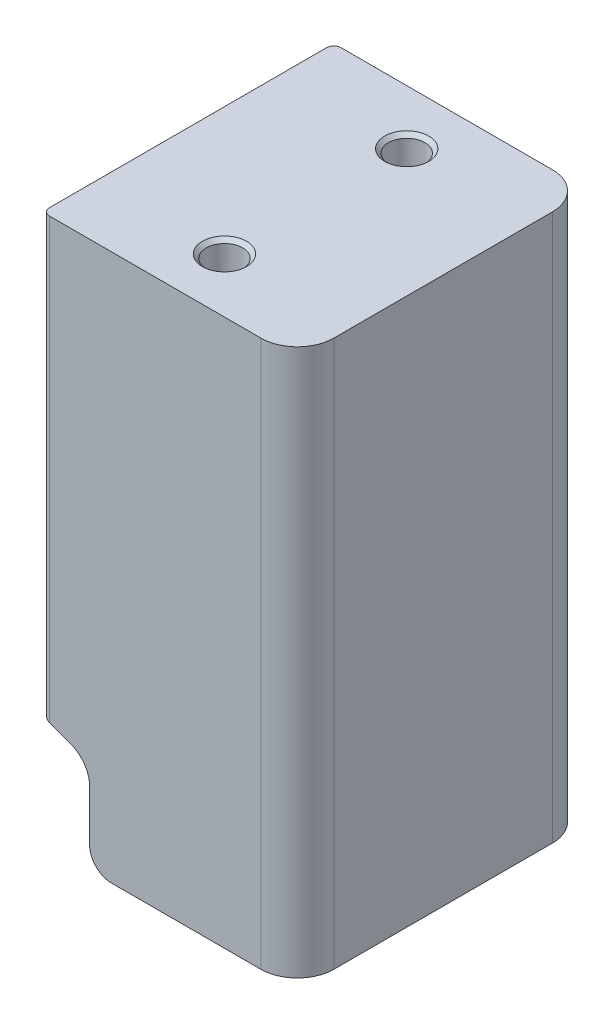
ISO-10303-21;
HEADER;
FILE_DESCRIPTION(('STEP AP214'),'2;1');
FILE_NAME('part.step','',(''),(''),'','','');
FILE_SCHEMA(('AUTOMOTIVE_DESIGN { 1 0 10303 214 1 1 1 1 }'));
ENDSEC;
DATA;
#1=APPLICATION_CONTEXT('core data for automotive mechanical design processes');
#2=APPLICATION_PROTOCOL_DEFINITION('international standard','automotive_design',2000,#1);
#3=PRODUCT_CONTEXT('',#1,'mechanical');
#4=PRODUCT('Part','Part','',(#3));
#5=PRODUCT_RELATED_PRODUCT_CATEGORY('part','',(#4));
#6=PRODUCT_DEFINITION_FORMATION('','',#4);
#7=PRODUCT_DEFINITION_CONTEXT('part definition',#1,'design');
#8=PRODUCT_DEFINITION('design','',#6,#7);
#9=PRODUCT_DEFINITION_SHAPE('','',#8);
#10=(LENGTH_UNIT() NAMED_UNIT(*) SI_UNIT(.MILLI.,.METRE.));
#11=(NAMED_UNIT(*) PLANE_ANGLE_UNIT() SI_UNIT($,.RADIAN.));
#12=(NAMED_UNIT(*) SI_UNIT($,.STERADIAN.) SOLID_ANGLE_UNIT());
#13=UNCERTAINTY_MEASURE_WITH_UNIT(LENGTH_MEASURE(1.E-05),#10,'distance_accuracy_value','');
#14=(GEOMETRIC_REPRESENTATION_CONTEXT(3) GLOBAL_UNCERTAINTY_ASSIGNED_CONTEXT((#13)) GLOBAL_UNIT_ASSIGNED_CONTEXT((#10,
#11,#12)) REPRESENTATION_CONTEXT('',''));
#15=CARTESIAN_POINT('',(0.,0.,0.));
#16=DIRECTION('',(0.,0.,1.));
#17=DIRECTION('',(1.,0.,0.));
#18=AXIS2_PLACEMENT_3D('',#15,#16,#17);
#19=CARTESIAN_POINT('',(17.5,-75.,20.));
#20=DIRECTION('',(1.,0.,0.));
#21=DIRECTION('',(0.,0.,-1.));
#22=AXIS2_PLACEMENT_3D('',#19,#20,#21);
#23=PLANE('',#22);
#24=DIRECTION('',(0.,0.,-1.));
#25=VECTOR('',#24,1.);
#26=CARTESIAN_POINT('',(17.5,-75.,20.));
#27=LINE('',#26,#25);
#28=CARTESIAN_POINT('',(17.5,-75.,15.));
#29=VERTEX_POINT('',#28);
#30=CARTESIAN_POINT('',(17.5,-75.,-15.));
#31=VERTEX_POINT('',#30);
#32=EDGE_CURVE('E194',#29,#31,#27,.T.);
#33=ORIENTED_EDGE('',*,*,#32,.T.);
#34=DIRECTION('',(0.,1.,0.));
#35=VECTOR('',#34,1.);
#36=CARTESIAN_POINT('',(17.5,-75.,-15.));
#37=LINE('',#36,#35);
#38=CARTESIAN_POINT('',(17.5,0.,-15.));
#39=VERTEX_POINT('',#38);
#40=EDGE_CURVE('E224',#31,#39,#37,.T.);
#41=ORIENTED_EDGE('',*,*,#40,.T.);
#42=DIRECTION('',(0.,0.,-1.));
#43=VECTOR('',#42,1.);
#44=CARTESIAN_POINT('',(17.5,0.,20.));
#45=LINE('',#44,#43);
#46=CARTESIAN_POINT('',(17.5,0.,15.));
#47=VERTEX_POINT('',#46);
#48=EDGE_CURVE('E189',#47,#39,#45,.T.);
#49=ORIENTED_EDGE('',*,*,#48,.F.);
#50=DIRECTION('',(0.,1.,0.));
#51=VECTOR('',#50,1.);
#52=CARTESIAN_POINT('',(17.5,-75.,15.));
#53=LINE('',#52,#51);
#54=EDGE_CURVE('E222',#47,#29,#53,.F.);
#55=ORIENTED_EDGE('',*,*,#54,.T.);
#56=EDGE_LOOP('',(#33,#41,#49,#55));
#57=FACE_BOUND('',#56,.T.);
#58=ADVANCED_FACE('F51',(#57),#23,.T.);
#59=CARTESIAN_POINT('',(-17.5,-75.,20.));
#60=DIRECTION('',(0.,0.,1.));
#61=DIRECTION('',(1.,0.,0.));
#62=AXIS2_PLACEMENT_3D('',#59,#60,#61);
#63=PLANE('',#62);
#64=DIRECTION('',(1.,0.,0.));
#65=VECTOR('',#64,1.);
#66=CARTESIAN_POINT('',(-17.5,0.,20.));
#67=LINE('',#66,#65);
#68=CARTESIAN_POINT('',(-16.5,0.,20.));
#69=VERTEX_POINT('',#68);
#70=CARTESIAN_POINT('',(12.5,0.,20.));
#71=VERTEX_POINT('',#70);
#72=EDGE_CURVE('E198',#69,#71,#67,.T.);
#73=ORIENTED_EDGE('',*,*,#72,.F.);
#74=DIRECTION('',(0.,1.,0.));
#75=VECTOR('',#74,1.);
#76=CARTESIAN_POINT('',(-16.5,-75.,20.));
#77=LINE('',#76,#75);
#78=CARTESIAN_POINT('',(-16.5,-60.197333558697,20.));
#79=VERTEX_POINT('',#78);
#80=EDGE_CURVE('E11',#69,#79,#77,.F.);
#81=ORIENTED_EDGE('',*,*,#80,.T.);
#82=DIRECTION('',(-0.939692620785908,0.34202014332567,0.));
#83=VECTOR('',#82,1.);
#84=CARTESIAN_POINT('',(-13.6319194266973,-61.2412295168564,20.));
#85=LINE('',#84,#83);
#86=CARTESIAN_POINT('',(-13.6319194266973,-61.2412295168564,20.));
#87=VERTEX_POINT('',#86);
#88=EDGE_CURVE('E184',#87,#79,#85,.T.);
#89=ORIENTED_EDGE('',*,*,#88,.F.);
#90=CARTESIAN_POINT('',(-15.,-65.,20.));
#91=DIRECTION('',(0.,0.,1.));
#92=DIRECTION('',(1.,0.,0.));
#93=AXIS2_PLACEMENT_3D('',#90,#91,#92);
#94=CIRCLE('',#93,4.);
#95=CARTESIAN_POINT('',(-11.,-65.,20.));
#96=VERTEX_POINT('',#95);
#97=EDGE_CURVE('E181',#96,#87,#94,.T.);
#98=ORIENTED_EDGE('',*,*,#97,.F.);
#99=DIRECTION('',(0.,1.,0.));
#100=VECTOR('',#99,1.);
#101=CARTESIAN_POINT('',(-11.,-65.,20.));
#102=LINE('',#101,#100);
#103=CARTESIAN_POINT('',(-11.,-72.,20.));
#104=VERTEX_POINT('',#103);
#105=EDGE_CURVE('E179',#104,#96,#102,.T.);
#106=ORIENTED_EDGE('',*,*,#105,.F.);
#107=CARTESIAN_POINT('',(-8.,-72.,20.));
#108=DIRECTION('',(0.,0.,1.));
#109=DIRECTION('',(1.,0.,0.));
#110=AXIS2_PLACEMENT_3D('',#107,#108,#109);
#111=CIRCLE('',#110,3.);
#112=CARTESIAN_POINT('',(-8.,-75.,20.));
#113=VERTEX_POINT('',#112);
#114=EDGE_CURVE('E215',#104,#113,#111,.T.);
#115=ORIENTED_EDGE('',*,*,#114,.T.);
#116=DIRECTION('',(1.,0.,0.));
#117=VECTOR('',#116,1.);
#118=CARTESIAN_POINT('',(-17.5,-75.,20.));
#119=LINE('',#118,#117);
#120=CARTESIAN_POINT('',(12.5,-75.,20.));
#121=VERTEX_POINT('',#120);
#122=EDGE_CURVE('E200',#113,#121,#119,.T.);
#123=ORIENTED_EDGE('',*,*,#122,.T.);
#124=DIRECTION('',(0.,1.,0.));
#125=VECTOR('',#124,1.);
#126=CARTESIAN_POINT('',(12.5,-75.,20.));
#127=LINE('',#126,#125);
#128=EDGE_CURVE('E237',#121,#71,#127,.T.);
#129=ORIENTED_EDGE('',*,*,#128,.T.);
#130=EDGE_LOOP('',(#73,#81,#89,#98,#106,#115,#123,#129));
#131=FACE_BOUND('',#130,.T.);
#132=ADVANCED_FACE('F271',(#131),#63,.T.);
#133=CARTESIAN_POINT('',(-17.5,-75.,20.));
#134=DIRECTION('',(-1.,0.,0.));
#135=DIRECTION('',(0.,0.,1.));
#136=AXIS2_PLACEMENT_3D('',#133,#134,#135);
#137=PLANE('',#136);
#138=DIRECTION('',(0.,0.,1.));
#139=VECTOR('',#138,1.);
#140=CARTESIAN_POINT('',(-17.5,0.,20.));
#141=LINE('',#140,#139);
#142=CARTESIAN_POINT('',(-17.5,0.,-19.));
#143=VERTEX_POINT('',#142);
#144=CARTESIAN_POINT('',(-17.5,0.,19.));
#145=VERTEX_POINT('',#144);
#146=EDGE_CURVE('E209',#143,#145,#141,.T.);
#147=ORIENTED_EDGE('',*,*,#146,.F.);
#148=DIRECTION('',(0.,1.,0.));
#149=VECTOR('',#148,1.);
#150=CARTESIAN_POINT('',(-17.5,-75.,-19.));
#151=LINE('',#150,#149);
#152=CARTESIAN_POINT('',(-17.5,-59.8333633244308,-19.));
#153=VERTEX_POINT('',#152);
#154=EDGE_CURVE('E250',#143,#153,#151,.F.);
#155=ORIENTED_EDGE('',*,*,#154,.T.);
#156=DIRECTION('',(0.,0.,1.));
#157=VECTOR('',#156,1.);
#158=CARTESIAN_POINT('',(-17.5,-59.8333633244308,-20.001));
#159=LINE('',#158,#157);
#160=CARTESIAN_POINT('',(-17.5,-59.8333633244308,19.));
#161=VERTEX_POINT('',#160);
#162=EDGE_CURVE('E187',#153,#161,#159,.T.);
#163=ORIENTED_EDGE('',*,*,#162,.T.);
#164=DIRECTION('',(0.,1.,0.));
#165=VECTOR('',#164,1.);
#166=CARTESIAN_POINT('',(-17.5,-75.,19.));
#167=LINE('',#166,#165);
#168=EDGE_CURVE('E247',#161,#145,#167,.T.);
#169=ORIENTED_EDGE('',*,*,#168,.T.);
#170=EDGE_LOOP('',(#147,#155,#163,#169));
#171=FACE_BOUND('',#170,.T.);
#172=ADVANCED_FACE('F267',(#171),#137,.T.);
#173=CARTESIAN_POINT('',(-17.5,-75.,-20.));
#174=DIRECTION('',(0.,0.,-1.));
#175=DIRECTION('',(-1.,0.,0.));
#176=AXIS2_PLACEMENT_3D('',#173,#174,#175);
#177=PLANE('',#176);
#178=DIRECTION('',(-0.939692620785908,0.34202014332567,0.));
#179=VECTOR('',#178,1.);
#180=CARTESIAN_POINT('',(-13.6319194266973,-61.2412295168564,-20.));
#181=LINE('',#180,#179);
#182=CARTESIAN_POINT('',(-13.6319194266973,-61.2412295168564,-20.));
#183=VERTEX_POINT('',#182);
#184=CARTESIAN_POINT('',(-16.5,-60.197333558697,-20.));
#185=VERTEX_POINT('',#184);
#186=EDGE_CURVE('E176',#183,#185,#181,.T.);
#187=ORIENTED_EDGE('',*,*,#186,.T.);
#188=DIRECTION('',(0.,1.,0.));
#189=VECTOR('',#188,1.);
#190=CARTESIAN_POINT('',(-16.5,-75.,-20.));
#191=LINE('',#190,#189);
#192=CARTESIAN_POINT('',(-16.5,0.,-20.));
#193=VERTEX_POINT('',#192);
#194=EDGE_CURVE('E240',#185,#193,#191,.T.);
#195=ORIENTED_EDGE('',*,*,#194,.T.);
#196=DIRECTION('',(-1.,0.,0.));
#197=VECTOR('',#196,1.);
#198=CARTESIAN_POINT('',(-17.5,0.,-20.));
#199=LINE('',#198,#197);
#200=CARTESIAN_POINT('',(12.5,0.,-20.));
#201=VERTEX_POINT('',#200);
#202=EDGE_CURVE('E206',#201,#193,#199,.T.);
#203=ORIENTED_EDGE('',*,*,#202,.F.);
#204=DIRECTION('',(0.,1.,0.));
#205=VECTOR('',#204,1.);
#206=CARTESIAN_POINT('',(12.5,-75.,-20.));
#207=LINE('',#206,#205);
#208=CARTESIAN_POINT('',(12.5,-75.,-20.));
#209=VERTEX_POINT('',#208);
#210=EDGE_CURVE('E231',#201,#209,#207,.F.);
#211=ORIENTED_EDGE('',*,*,#210,.T.);
#212=DIRECTION('',(-1.,0.,0.));
#213=VECTOR('',#212,1.);
#214=CARTESIAN_POINT('',(-17.5,-75.,-20.));
#215=LINE('',#214,#213);
#216=CARTESIAN_POINT('',(-8.,-75.,-20.));
#217=VERTEX_POINT('',#216);
#218=EDGE_CURVE('E197',#209,#217,#215,.T.);
#219=ORIENTED_EDGE('',*,*,#218,.T.);
#220=CARTESIAN_POINT('',(-8.,-72.,-20.));
#221=DIRECTION('',(0.,0.,-1.));
#222=DIRECTION('',(-1.,0.,0.));
#223=AXIS2_PLACEMENT_3D('',#220,#221,#222);
#224=CIRCLE('',#223,3.);
#225=CARTESIAN_POINT('',(-11.,-72.,-20.));
#226=VERTEX_POINT('',#225);
#227=EDGE_CURVE('E220',#217,#226,#224,.T.);
#228=ORIENTED_EDGE('',*,*,#227,.T.);
#229=DIRECTION('',(0.,1.,0.));
#230=VECTOR('',#229,1.);
#231=CARTESIAN_POINT('',(-11.,-65.,-20.));
#232=LINE('',#231,#230);
#233=CARTESIAN_POINT('',(-11.,-65.,-20.));
#234=VERTEX_POINT('',#233);
#235=EDGE_CURVE('E171',#226,#234,#232,.T.);
#236=ORIENTED_EDGE('',*,*,#235,.T.);
#237=CARTESIAN_POINT('',(-15.,-65.,-20.));
#238=DIRECTION('',(0.,0.,-1.));
#239=DIRECTION('',(-1.,0.,0.));
#240=AXIS2_PLACEMENT_3D('',#237,#238,#239);
#241=CIRCLE('',#240,4.);
#242=EDGE_CURVE('E173',#234,#183,#241,.F.);
#243=ORIENTED_EDGE('',*,*,#242,.T.);
#244=EDGE_LOOP('',(#187,#195,#203,#211,#219,#228,#236,#243));
#245=FACE_BOUND('',#244,.T.);
#246=ADVANCED_FACE('F259',(#245),#177,.T.);
#247=CARTESIAN_POINT('',(0.,-75.,0.));
#248=DIRECTION('',(0.,-1.,0.));
#249=DIRECTION('',(0.,0.,-1.));
#250=AXIS2_PLACEMENT_3D('',#247,#248,#249);
#251=PLANE('',#250);
#252=ORIENTED_EDGE('',*,*,#218,.F.);
#253=CARTESIAN_POINT('',(12.5,-75.,-15.));
#254=DIRECTION('',(0.,-1.,0.));
#255=DIRECTION('',(0.,0.,-1.));
#256=AXIS2_PLACEMENT_3D('',#253,#254,#255);
#257=CIRCLE('',#256,5.);
#258=EDGE_CURVE('E235',#209,#31,#257,.T.);
#259=ORIENTED_EDGE('',*,*,#258,.T.);
#260=ORIENTED_EDGE('',*,*,#32,.F.);
#261=CARTESIAN_POINT('',(12.5,-75.,15.));
#262=DIRECTION('',(0.,-1.,0.));
#263=DIRECTION('',(0.,0.,-1.));
#264=AXIS2_PLACEMENT_3D('',#261,#262,#263);
#265=CIRCLE('',#264,5.);
#266=EDGE_CURVE('E233',#29,#121,#265,.T.);
#267=ORIENTED_EDGE('',*,*,#266,.T.);
#268=ORIENTED_EDGE('',*,*,#122,.F.);
#269=DIRECTION('',(0.,0.,1.));
#270=VECTOR('',#269,1.);
#271=CARTESIAN_POINT('',(-8.,-75.,-20.));
#272=LINE('',#271,#270);
#273=EDGE_CURVE('E217',#113,#217,#272,.F.);
#274=ORIENTED_EDGE('',*,*,#273,.T.);
#275=EDGE_LOOP('',(#252,#259,#260,#267,#268,#274));
#276=FACE_BOUND('',#275,.T.);
#277=ADVANCED_FACE('F288',(#276),#251,.T.);
#278=CARTESIAN_POINT('',(0.,0.,0.));
#279=DIRECTION('',(0.,-1.,0.));
#280=DIRECTION('',(0.,0.,-1.));
#281=AXIS2_PLACEMENT_3D('',#278,#279,#280);
#282=PLANE('',#281);
#283=CARTESIAN_POINT('',(0.,0.,-12.5));
#284=DIRECTION('',(0.,1.,0.));
#285=DIRECTION('',(0.,0.,1.));
#286=AXIS2_PLACEMENT_3D('',#283,#284,#285);
#287=CIRCLE('',#286,3.025);
#288=CARTESIAN_POINT('',(0.,0.,-9.475));
#289=VERTEX_POINT('',#288);
#290=EDGE_CURVE('E162',#289,#289,#287,.T.);
#291=ORIENTED_EDGE('',*,*,#290,.F.);
#292=EDGE_LOOP('',(#291));
#293=FACE_BOUND('',#292,.T.);
#294=CARTESIAN_POINT('',(0.,0.,12.5));
#295=DIRECTION('',(0.,1.,0.));
#296=DIRECTION('',(0.,0.,1.));
#297=AXIS2_PLACEMENT_3D('',#294,#295,#296);
#298=CIRCLE('',#297,3.025);
#299=CARTESIAN_POINT('',(0.,0.,15.525));
#300=VERTEX_POINT('',#299);
#301=EDGE_CURVE('E155',#300,#300,#298,.T.);
#302=ORIENTED_EDGE('',*,*,#301,.F.);
#303=EDGE_LOOP('',(#302));
#304=FACE_BOUND('',#303,.T.);
#305=ORIENTED_EDGE('',*,*,#202,.T.);
#306=CARTESIAN_POINT('',(-16.5,0.,-19.));
#307=DIRECTION('',(0.,-1.,0.));
#308=DIRECTION('',(0.,0.,-1.));
#309=AXIS2_PLACEMENT_3D('',#306,#307,#308);
#310=CIRCLE('',#309,1.);
#311=EDGE_CURVE('E245',#193,#143,#310,.F.);
#312=ORIENTED_EDGE('',*,*,#311,.T.);
#313=ORIENTED_EDGE('',*,*,#146,.T.);
#314=CARTESIAN_POINT('',(-16.5,0.,19.));
#315=DIRECTION('',(0.,-1.,0.));
#316=DIRECTION('',(0.,0.,-1.));
#317=AXIS2_PLACEMENT_3D('',#314,#315,#316);
#318=CIRCLE('',#317,1.);
#319=EDGE_CURVE('E243',#145,#69,#318,.F.);
#320=ORIENTED_EDGE('',*,*,#319,.T.);
#321=ORIENTED_EDGE('',*,*,#72,.T.);
#322=CARTESIAN_POINT('',(12.5,0.,15.));
#323=DIRECTION('',(0.,-1.,0.));
#324=DIRECTION('',(0.,0.,-1.));
#325=AXIS2_PLACEMENT_3D('',#322,#323,#324);
#326=CIRCLE('',#325,5.);
#327=EDGE_CURVE('E227',#71,#47,#326,.F.);
#328=ORIENTED_EDGE('',*,*,#327,.T.);
#329=ORIENTED_EDGE('',*,*,#48,.T.);
#330=CARTESIAN_POINT('',(12.5,0.,-15.));
#331=DIRECTION('',(0.,-1.,0.));
#332=DIRECTION('',(0.,0.,-1.));
#333=AXIS2_PLACEMENT_3D('',#330,#331,#332);
#334=CIRCLE('',#333,5.);
#335=EDGE_CURVE('E229',#39,#201,#334,.F.);
#336=ORIENTED_EDGE('',*,*,#335,.T.);
#337=EDGE_LOOP('',(#305,#312,#313,#320,#321,#328,#329,#336));
#338=FACE_BOUND('',#337,.T.);
#339=ADVANCED_FACE('F265',(#293,#304,#338),#282,.F.);
#340=CARTESIAN_POINT('',(-13.6319194266973,-61.2412295168564,-20.001));
#341=DIRECTION('',(0.34202014332567,0.939692620785908,0.));
#342=DIRECTION('',(-0.939692620785908,0.34202014332567,0.));
#343=AXIS2_PLACEMENT_3D('',#340,#341,#342);
#344=PLANE('',#343);
#345=ORIENTED_EDGE('',*,*,#162,.F.);
#346=CARTESIAN_POINT('',(-16.5,-60.1973335586971,-19.));
#347=DIRECTION('',(0.34202014332567,0.939692620785908,0.));
#348=DIRECTION('',(-0.939692620785908,0.34202014332567,0.));
#349=AXIS2_PLACEMENT_3D('',#346,#347,#348);
#350=ELLIPSE('',#349,1.06417777247591,1.);
#351=EDGE_CURVE('E59',#153,#185,#350,.F.);
#352=ORIENTED_EDGE('',*,*,#351,.T.);
#353=ORIENTED_EDGE('',*,*,#186,.F.);
#354=DIRECTION('',(0.,0.,1.));
#355=VECTOR('',#354,1.);
#356=CARTESIAN_POINT('',(-13.6319194266973,-61.2412295168564,-20.001));
#357=LINE('',#356,#355);
#358=EDGE_CURVE('E190',#183,#87,#357,.T.);
#359=ORIENTED_EDGE('',*,*,#358,.T.);
#360=ORIENTED_EDGE('',*,*,#88,.T.);
#361=CARTESIAN_POINT('',(-16.5,-60.1973335586971,19.));
#362=DIRECTION('',(0.34202014332567,0.939692620785908,0.));
#363=DIRECTION('',(-0.939692620785908,0.34202014332567,0.));
#364=AXIS2_PLACEMENT_3D('',#361,#362,#363);
#365=ELLIPSE('',#364,1.06417777247591,1.);
#366=EDGE_CURVE('E71',#79,#161,#365,.F.);
#367=ORIENTED_EDGE('',*,*,#366,.T.);
#368=EDGE_LOOP('',(#345,#352,#353,#359,#360,#367));
#369=FACE_BOUND('',#368,.T.);
#370=ADVANCED_FACE('F253',(#369),#344,.F.);
#371=CARTESIAN_POINT('',(-15.,-65.,-20.001));
#372=DIRECTION('',(0.,0.,1.));
#373=DIRECTION('',(1.,0.,0.));
#374=AXIS2_PLACEMENT_3D('',#371,#372,#373);
#375=CYLINDRICAL_SURFACE('',#374,4.);
#376=DIRECTION('',(0.,0.,1.));
#377=VECTOR('',#376,1.);
#378=CARTESIAN_POINT('',(-11.,-65.,-20.001));
#379=LINE('',#378,#377);
#380=EDGE_CURVE('E186',#234,#96,#379,.T.);
#381=ORIENTED_EDGE('',*,*,#380,.T.);
#382=ORIENTED_EDGE('',*,*,#97,.T.);
#383=ORIENTED_EDGE('',*,*,#358,.F.);
#384=ORIENTED_EDGE('',*,*,#242,.F.);
#385=EDGE_LOOP('',(#381,#382,#383,#384));
#386=FACE_BOUND('',#385,.T.);
#387=ADVANCED_FACE('F301',(#386),#375,.F.);
#388=CARTESIAN_POINT('',(-11.,-65.,-20.001));
#389=DIRECTION('',(1.,0.,0.));
#390=DIRECTION('',(0.,1.,0.));
#391=AXIS2_PLACEMENT_3D('',#388,#389,#390);
#392=PLANE('',#391);
#393=ORIENTED_EDGE('',*,*,#235,.F.);
#394=DIRECTION('',(0.,0.,1.));
#395=VECTOR('',#394,1.);
#396=CARTESIAN_POINT('',(-11.,-72.,20.));
#397=LINE('',#396,#395);
#398=EDGE_CURVE('E203',#226,#104,#397,.T.);
#399=ORIENTED_EDGE('',*,*,#398,.T.);
#400=ORIENTED_EDGE('',*,*,#105,.T.);
#401=ORIENTED_EDGE('',*,*,#380,.F.);
#402=EDGE_LOOP('',(#393,#399,#400,#401));
#403=FACE_BOUND('',#402,.T.);
#404=ADVANCED_FACE('F297',(#403),#392,.F.);
#405=CARTESIAN_POINT('',(-8.,-72.,-20.001));
#406=DIRECTION('',(0.,0.,-1.));
#407=DIRECTION('',(-1.,0.,0.));
#408=AXIS2_PLACEMENT_3D('',#405,#406,#407);
#409=CYLINDRICAL_SURFACE('',#408,3.);
#410=ORIENTED_EDGE('',*,*,#227,.F.);
#411=ORIENTED_EDGE('',*,*,#273,.F.);
#412=ORIENTED_EDGE('',*,*,#114,.F.);
#413=ORIENTED_EDGE('',*,*,#398,.F.);
#414=EDGE_LOOP('',(#410,#411,#412,#413));
#415=FACE_BOUND('',#414,.T.);
#416=ADVANCED_FACE('F293',(#415),#409,.T.);
#417=CARTESIAN_POINT('',(12.5,-75.,-15.));
#418=DIRECTION('',(0.,1.,0.));
#419=DIRECTION('',(0.,0.,1.));
#420=AXIS2_PLACEMENT_3D('',#417,#418,#419);
#421=CYLINDRICAL_SURFACE('',#420,5.);
#422=ORIENTED_EDGE('',*,*,#258,.F.);
#423=ORIENTED_EDGE('',*,*,#210,.F.);
#424=ORIENTED_EDGE('',*,*,#335,.F.);
#425=ORIENTED_EDGE('',*,*,#40,.F.);
#426=EDGE_LOOP('',(#422,#423,#424,#425));
#427=FACE_BOUND('',#426,.T.);
#428=ADVANCED_FACE('F284',(#427),#421,.T.);
#429=CARTESIAN_POINT('',(12.5,-75.,15.));
#430=DIRECTION('',(0.,1.,0.));
#431=DIRECTION('',(0.,0.,1.));
#432=AXIS2_PLACEMENT_3D('',#429,#430,#431);
#433=CYLINDRICAL_SURFACE('',#432,5.);
#434=ORIENTED_EDGE('',*,*,#266,.F.);
#435=ORIENTED_EDGE('',*,*,#54,.F.);
#436=ORIENTED_EDGE('',*,*,#327,.F.);
#437=ORIENTED_EDGE('',*,*,#128,.F.);
#438=EDGE_LOOP('',(#434,#435,#436,#437));
#439=FACE_BOUND('',#438,.T.);
#440=ADVANCED_FACE('F276',(#439),#433,.T.);
#441=CARTESIAN_POINT('',(0.,-17.,12.5));
#442=DIRECTION('',(0.,1.,0.));
#443=DIRECTION('',(0.,0.,1.));
#444=AXIS2_PLACEMENT_3D('',#441,#442,#443);
#445=CONICAL_SURFACE('',#444,2.49999999999999,1.02974425867665);
#446=CARTESIAN_POINT('',(0.,-18.5021515475689,12.5));
#447=VERTEX_POINT('',#446);
#448=VERTEX_LOOP('',#447);
#449=FACE_BOUND('',#448,.T.);
#450=CARTESIAN_POINT('',(0.,-17.,12.5));
#451=DIRECTION('',(0.,1.,0.));
#452=DIRECTION('',(0.,0.,1.));
#453=AXIS2_PLACEMENT_3D('',#450,#451,#452);
#454=CIRCLE('',#453,2.49999999999999);
#455=CARTESIAN_POINT('',(0.,-17.,15.));
#456=VERTEX_POINT('',#455);
#457=EDGE_CURVE('E168',#456,#456,#454,.T.);
#458=ORIENTED_EDGE('',*,*,#457,.T.);
#459=EDGE_LOOP('',(#458));
#460=FACE_BOUND('',#459,.T.);
#461=ADVANCED_FACE('F325',(#449,#460),#445,.F.);
#462=CARTESIAN_POINT('',(0.,0.,12.5));
#463=DIRECTION('',(0.,1.,0.));
#464=DIRECTION('',(0.,0.,1.));
#465=AXIS2_PLACEMENT_3D('',#462,#463,#464);
#466=CYLINDRICAL_SURFACE('',#465,2.49999999999999);
#467=ORIENTED_EDGE('',*,*,#457,.F.);
#468=EDGE_LOOP('',(#467));
#469=FACE_BOUND('',#468,.T.);
#470=CARTESIAN_POINT('',(0.,-0.525000000000012,12.5));
#471=DIRECTION('',(0.,1.,0.));
#472=DIRECTION('',(0.,0.,1.));
#473=AXIS2_PLACEMENT_3D('',#470,#471,#472);
#474=CIRCLE('',#473,2.49999999999999);
#475=CARTESIAN_POINT('',(0.,-0.525000000000012,15.));
#476=VERTEX_POINT('',#475);
#477=EDGE_CURVE('E159',#476,#476,#474,.T.);
#478=ORIENTED_EDGE('',*,*,#477,.T.);
#479=EDGE_LOOP('',(#478));
#480=FACE_BOUND('',#479,.T.);
#481=ADVANCED_FACE('F345',(#469,#480),#466,.F.);
#482=CARTESIAN_POINT('',(0.,0.,12.5));
#483=DIRECTION('',(0.,1.,0.));
#484=DIRECTION('',(0.,0.,1.));
#485=AXIS2_PLACEMENT_3D('',#482,#483,#484);
#486=CONICAL_SURFACE('',#485,3.025,0.785398163397445);
#487=ORIENTED_EDGE('',*,*,#477,.F.);
#488=EDGE_LOOP('',(#487));
#489=FACE_BOUND('',#488,.T.);
#490=ORIENTED_EDGE('',*,*,#301,.T.);
#491=EDGE_LOOP('',(#490));
#492=FACE_BOUND('',#491,.T.);
#493=ADVANCED_FACE('F149',(#489,#492),#486,.F.);
#494=CARTESIAN_POINT('',(0.,-17.,-12.5));
#495=DIRECTION('',(0.,1.,0.));
#496=DIRECTION('',(0.,0.,1.));
#497=AXIS2_PLACEMENT_3D('',#494,#495,#496);
#498=CONICAL_SURFACE('',#497,2.49999999999999,1.02974425867665);
#499=CARTESIAN_POINT('',(0.,-18.5021515475689,-12.5));
#500=VERTEX_POINT('',#499);
#501=VERTEX_LOOP('',#500);
#502=FACE_BOUND('',#501,.T.);
#503=CARTESIAN_POINT('',(0.,-17.,-12.5));
#504=DIRECTION('',(0.,1.,0.));
#505=DIRECTION('',(0.,0.,1.));
#506=AXIS2_PLACEMENT_3D('',#503,#504,#505);
#507=CIRCLE('',#506,2.49999999999999);
#508=CARTESIAN_POINT('',(0.,-17.,-10.));
#509=VERTEX_POINT('',#508);
#510=EDGE_CURVE('E153',#509,#509,#507,.T.);
#511=ORIENTED_EDGE('',*,*,#510,.T.);
#512=EDGE_LOOP('',(#511));
#513=FACE_BOUND('',#512,.T.);
#514=ADVANCED_FACE('F145',(#502,#513),#498,.F.);
#515=CARTESIAN_POINT('',(0.,0.,-12.5));
#516=DIRECTION('',(0.,1.,0.));
#517=DIRECTION('',(0.,0.,1.));
#518=AXIS2_PLACEMENT_3D('',#515,#516,#517);
#519=CYLINDRICAL_SURFACE('',#518,2.49999999999999);
#520=ORIENTED_EDGE('',*,*,#510,.F.);
#521=EDGE_LOOP('',(#520));
#522=FACE_BOUND('',#521,.T.);
#523=CARTESIAN_POINT('',(0.,-0.525000000000012,-12.5));
#524=DIRECTION('',(0.,1.,0.));
#525=DIRECTION('',(0.,0.,1.));
#526=AXIS2_PLACEMENT_3D('',#523,#524,#525);
#527=CIRCLE('',#526,2.49999999999999);
#528=CARTESIAN_POINT('',(0.,-0.525000000000012,-10.));
#529=VERTEX_POINT('',#528);
#530=EDGE_CURVE('E156',#529,#529,#527,.T.);
#531=ORIENTED_EDGE('',*,*,#530,.T.);
#532=EDGE_LOOP('',(#531));
#533=FACE_BOUND('',#532,.T.);
#534=ADVANCED_FACE('F148',(#522,#533),#519,.F.);
#535=CARTESIAN_POINT('',(0.,0.,-12.5));
#536=DIRECTION('',(0.,1.,0.));
#537=DIRECTION('',(0.,0.,1.));
#538=AXIS2_PLACEMENT_3D('',#535,#536,#537);
#539=CONICAL_SURFACE('',#538,3.025,0.785398163397445);
#540=ORIENTED_EDGE('',*,*,#530,.F.);
#541=EDGE_LOOP('',(#540));
#542=FACE_BOUND('',#541,.T.);
#543=ORIENTED_EDGE('',*,*,#290,.T.);
#544=EDGE_LOOP('',(#543));
#545=FACE_BOUND('',#544,.T.);
#546=ADVANCED_FACE('F327',(#542,#545),#539,.F.);
#547=CARTESIAN_POINT('',(-16.5,-75.,-19.));
#548=DIRECTION('',(0.,1.,0.));
#549=DIRECTION('',(0.,0.,1.));
#550=AXIS2_PLACEMENT_3D('',#547,#548,#549);
#551=CYLINDRICAL_SURFACE('',#550,1.);
#552=ORIENTED_EDGE('',*,*,#351,.F.);
#553=ORIENTED_EDGE('',*,*,#154,.F.);
#554=ORIENTED_EDGE('',*,*,#311,.F.);
#555=ORIENTED_EDGE('',*,*,#194,.F.);
#556=EDGE_LOOP('',(#552,#553,#554,#555));
#557=FACE_BOUND('',#556,.T.);
#558=ADVANCED_FACE('F262',(#557),#551,.T.);
#559=CARTESIAN_POINT('',(-16.5,-75.,19.));
#560=DIRECTION('',(0.,1.,0.));
#561=DIRECTION('',(0.,0.,1.));
#562=AXIS2_PLACEMENT_3D('',#559,#560,#561);
#563=CYLINDRICAL_SURFACE('',#562,1.);
#564=ORIENTED_EDGE('',*,*,#366,.F.);
#565=ORIENTED_EDGE('',*,*,#80,.F.);
#566=ORIENTED_EDGE('',*,*,#319,.F.);
#567=ORIENTED_EDGE('',*,*,#168,.F.);
#568=EDGE_LOOP('',(#564,#565,#566,#567));
#569=FACE_BOUND('',#568,.T.);
#570=ADVANCED_FACE('F53',(#569),#563,.T.);
#571=CLOSED_SHELL('',(#58,#132,#172,#246,#277,#339,#370,#387,#404,#416,#428,#440,#461,#481,#493,
#514,#534,#546,#558,#570));
#572=MANIFOLD_SOLID_BREP('B2',#571);
#573=ADVANCED_BREP_SHAPE_REPRESENTATION('',(#18,#572),#14);
#574=SHAPE_DEFINITION_REPRESENTATION(#9,#573);
ENDSEC;
END-ISO-10303-21;
